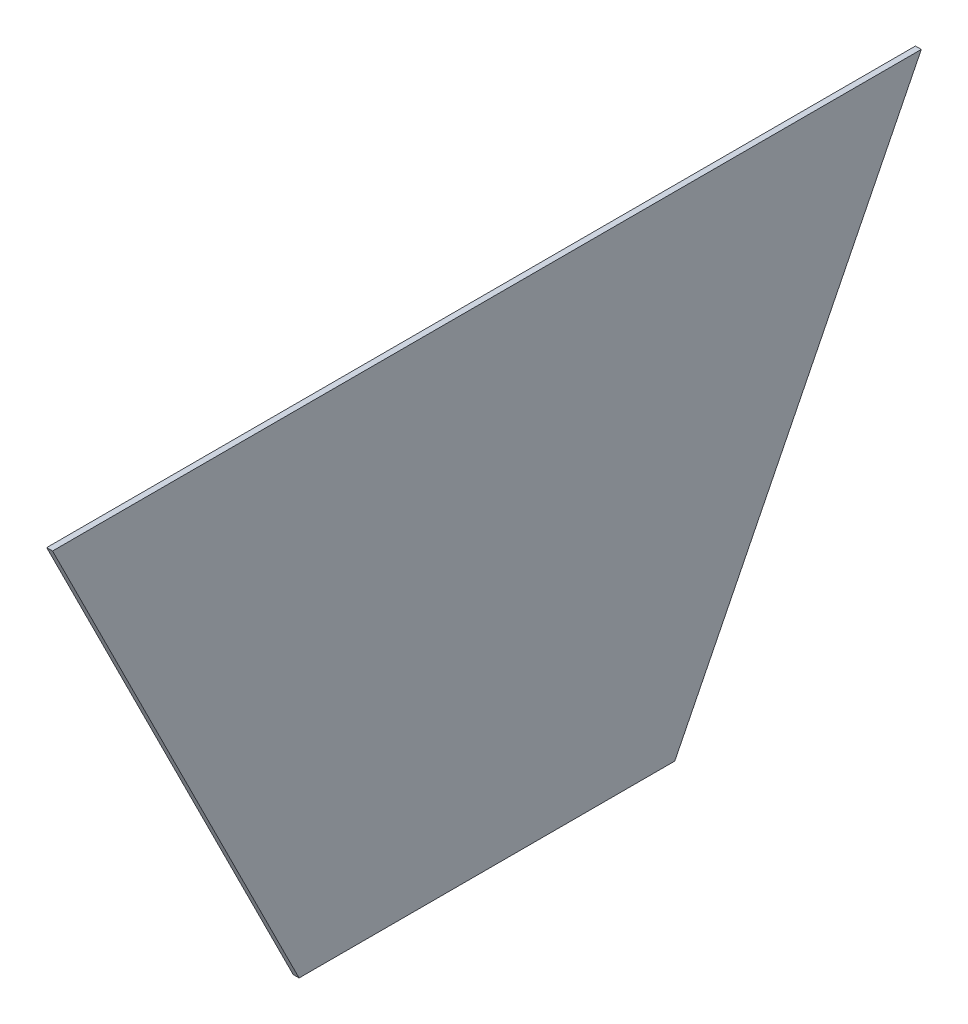
ISO-10303-21;
HEADER;
FILE_DESCRIPTION(('STEP AP214'),'2;1');
FILE_NAME('part.step','',(''),(''),'','','');
FILE_SCHEMA(('AUTOMOTIVE_DESIGN { 1 0 10303 214 1 1 1 1 }'));
ENDSEC;
DATA;
#1=APPLICATION_CONTEXT('core data for automotive mechanical design processes');
#2=APPLICATION_PROTOCOL_DEFINITION('international standard','automotive_design',2000,#1);
#3=PRODUCT_CONTEXT('',#1,'mechanical');
#4=PRODUCT('Part','Part','',(#3));
#5=PRODUCT_RELATED_PRODUCT_CATEGORY('part','',(#4));
#6=PRODUCT_DEFINITION_FORMATION('','',#4);
#7=PRODUCT_DEFINITION_CONTEXT('part definition',#1,'design');
#8=PRODUCT_DEFINITION('design','',#6,#7);
#9=PRODUCT_DEFINITION_SHAPE('','',#8);
#10=(LENGTH_UNIT() NAMED_UNIT(*) SI_UNIT(.MILLI.,.METRE.));
#11=(NAMED_UNIT(*) PLANE_ANGLE_UNIT() SI_UNIT($,.RADIAN.));
#12=(NAMED_UNIT(*) SI_UNIT($,.STERADIAN.) SOLID_ANGLE_UNIT());
#13=UNCERTAINTY_MEASURE_WITH_UNIT(LENGTH_MEASURE(1.E-05),#10,'distance_accuracy_value','');
#14=(GEOMETRIC_REPRESENTATION_CONTEXT(3) GLOBAL_UNCERTAINTY_ASSIGNED_CONTEXT((#13)) GLOBAL_UNIT_ASSIGNED_CONTEXT((#10,
#11,#12)) REPRESENTATION_CONTEXT('',''));
#15=CARTESIAN_POINT('',(0.,0.,0.));
#16=DIRECTION('',(0.,0.,1.));
#17=DIRECTION('',(1.,0.,0.));
#18=AXIS2_PLACEMENT_3D('',#15,#16,#17);
#19=CARTESIAN_POINT('',(3.175,0.,0.));
#20=DIRECTION('',(0.,1.,0.));
#21=DIRECTION('',(0.,0.,1.));
#22=AXIS2_PLACEMENT_3D('',#19,#20,#21);
#23=PLANE('',#22);
#24=DIRECTION('',(0.,0.,-1.));
#25=VECTOR('',#24,1.);
#26=CARTESIAN_POINT('',(0.,0.,0.));
#27=LINE('',#26,#25);
#28=CARTESIAN_POINT('',(0.,0.,101.6));
#29=VERTEX_POINT('',#28);
#30=CARTESIAN_POINT('',(0.,0.,-101.6));
#31=VERTEX_POINT('',#30);
#32=EDGE_CURVE('E72',#29,#31,#27,.T.);
#33=ORIENTED_EDGE('',*,*,#32,.T.);
#34=DIRECTION('',(-1.,0.,0.));
#35=VECTOR('',#34,1.);
#36=CARTESIAN_POINT('',(3.175,0.,-101.6));
#37=LINE('',#36,#35);
#38=CARTESIAN_POINT('',(3.175,0.,-101.6));
#39=VERTEX_POINT('',#38);
#40=EDGE_CURVE('E11',#39,#31,#37,.T.);
#41=ORIENTED_EDGE('',*,*,#40,.F.);
#42=DIRECTION('',(0.,0.,-1.));
#43=VECTOR('',#42,1.);
#44=CARTESIAN_POINT('',(3.175,0.,0.));
#45=LINE('',#44,#43);
#46=CARTESIAN_POINT('',(3.175,0.,101.6));
#47=VERTEX_POINT('',#46);
#48=EDGE_CURVE('E77',#47,#39,#45,.T.);
#49=ORIENTED_EDGE('',*,*,#48,.F.);
#50=DIRECTION('',(-1.,0.,0.));
#51=VECTOR('',#50,1.);
#52=CARTESIAN_POINT('',(3.175,0.,101.6));
#53=LINE('',#52,#51);
#54=EDGE_CURVE('E92',#47,#29,#53,.T.);
#55=ORIENTED_EDGE('',*,*,#54,.T.);
#56=EDGE_LOOP('',(#33,#41,#49,#55));
#57=FACE_BOUND('',#56,.T.);
#58=ADVANCED_FACE('F32',(#57),#23,.F.);
#59=CARTESIAN_POINT('',(3.175,0.,-101.6));
#60=DIRECTION('',(0.,0.447213595499958,0.894427190999916));
#61=DIRECTION('',(0.,-0.894427190999916,0.447213595499958));
#62=AXIS2_PLACEMENT_3D('',#59,#60,#61);
#63=PLANE('',#62);
#64=DIRECTION('',(0.,0.894427190999916,-0.447213595499958));
#65=VECTOR('',#64,1.);
#66=CARTESIAN_POINT('',(0.,0.,-101.6));
#67=LINE('',#66,#65);
#68=CARTESIAN_POINT('',(0.,266.7,-234.95));
#69=VERTEX_POINT('',#68);
#70=EDGE_CURVE('E88',#31,#69,#67,.T.);
#71=ORIENTED_EDGE('',*,*,#70,.T.);
#72=DIRECTION('',(-1.,0.,0.));
#73=VECTOR('',#72,1.);
#74=CARTESIAN_POINT('',(3.175,266.7,-234.95));
#75=LINE('',#74,#73);
#76=CARTESIAN_POINT('',(3.175,266.7,-234.95));
#77=VERTEX_POINT('',#76);
#78=EDGE_CURVE('E40',#77,#69,#75,.T.);
#79=ORIENTED_EDGE('',*,*,#78,.F.);
#80=DIRECTION('',(0.,0.894427190999916,-0.447213595499958));
#81=VECTOR('',#80,1.);
#82=CARTESIAN_POINT('',(3.175,0.,-101.6));
#83=LINE('',#82,#81);
#84=EDGE_CURVE('E80',#39,#77,#83,.T.);
#85=ORIENTED_EDGE('',*,*,#84,.F.);
#86=ORIENTED_EDGE('',*,*,#40,.T.);
#87=EDGE_LOOP('',(#71,#79,#85,#86));
#88=FACE_BOUND('',#87,.T.);
#89=ADVANCED_FACE('F87',(#88),#63,.F.);
#90=CARTESIAN_POINT('',(3.175,266.7,-234.95));
#91=DIRECTION('',(0.,-1.,0.));
#92=DIRECTION('',(0.,0.,-1.));
#93=AXIS2_PLACEMENT_3D('',#90,#91,#92);
#94=PLANE('',#93);
#95=DIRECTION('',(0.,0.,1.));
#96=VECTOR('',#95,1.);
#97=CARTESIAN_POINT('',(0.,266.7,-234.95));
#98=LINE('',#97,#96);
#99=CARTESIAN_POINT('',(0.,266.7,234.95));
#100=VERTEX_POINT('',#99);
#101=EDGE_CURVE('E65',#69,#100,#98,.T.);
#102=ORIENTED_EDGE('',*,*,#101,.T.);
#103=DIRECTION('',(-1.,0.,0.));
#104=VECTOR('',#103,1.);
#105=CARTESIAN_POINT('',(3.175,266.7,234.95));
#106=LINE('',#105,#104);
#107=CARTESIAN_POINT('',(3.175,266.7,234.95));
#108=VERTEX_POINT('',#107);
#109=EDGE_CURVE('E89',#108,#100,#106,.T.);
#110=ORIENTED_EDGE('',*,*,#109,.F.);
#111=DIRECTION('',(0.,0.,1.));
#112=VECTOR('',#111,1.);
#113=CARTESIAN_POINT('',(3.175,266.7,-234.95));
#114=LINE('',#113,#112);
#115=EDGE_CURVE('E84',#77,#108,#114,.T.);
#116=ORIENTED_EDGE('',*,*,#115,.F.);
#117=ORIENTED_EDGE('',*,*,#78,.T.);
#118=EDGE_LOOP('',(#102,#110,#116,#117));
#119=FACE_BOUND('',#118,.T.);
#120=ADVANCED_FACE('F90',(#119),#94,.F.);
#121=CARTESIAN_POINT('',(3.175,0.,101.6));
#122=DIRECTION('',(0.,0.447213595499958,-0.894427190999916));
#123=DIRECTION('',(0.,0.894427190999916,0.447213595499958));
#124=AXIS2_PLACEMENT_3D('',#121,#122,#123);
#125=PLANE('',#124);
#126=DIRECTION('',(0.,-0.894427190999916,-0.447213595499958));
#127=VECTOR('',#126,1.);
#128=CARTESIAN_POINT('',(0.,0.,101.6));
#129=LINE('',#128,#127);
#130=EDGE_CURVE('E99',#100,#29,#129,.T.);
#131=ORIENTED_EDGE('',*,*,#130,.T.);
#132=ORIENTED_EDGE('',*,*,#54,.F.);
#133=DIRECTION('',(0.,-0.894427190999916,-0.447213595499958));
#134=VECTOR('',#133,1.);
#135=CARTESIAN_POINT('',(3.175,0.,101.6));
#136=LINE('',#135,#134);
#137=EDGE_CURVE('E48',#108,#47,#136,.T.);
#138=ORIENTED_EDGE('',*,*,#137,.F.);
#139=ORIENTED_EDGE('',*,*,#109,.T.);
#140=EDGE_LOOP('',(#131,#132,#138,#139));
#141=FACE_BOUND('',#140,.T.);
#142=ADVANCED_FACE('F104',(#141),#125,.F.);
#143=CARTESIAN_POINT('',(3.175,0.,0.));
#144=DIRECTION('',(-1.,0.,0.));
#145=DIRECTION('',(0.,0.,1.));
#146=AXIS2_PLACEMENT_3D('',#143,#144,#145);
#147=PLANE('',#146);
#148=ORIENTED_EDGE('',*,*,#48,.T.);
#149=ORIENTED_EDGE('',*,*,#84,.T.);
#150=ORIENTED_EDGE('',*,*,#115,.T.);
#151=ORIENTED_EDGE('',*,*,#137,.T.);
#152=EDGE_LOOP('',(#148,#149,#150,#151));
#153=FACE_BOUND('',#152,.T.);
#154=ADVANCED_FACE('F82',(#153),#147,.F.);
#155=CARTESIAN_POINT('',(0.,0.,0.));
#156=DIRECTION('',(-1.,0.,0.));
#157=DIRECTION('',(0.,0.,1.));
#158=AXIS2_PLACEMENT_3D('',#155,#156,#157);
#159=PLANE('',#158);
#160=ORIENTED_EDGE('',*,*,#32,.F.);
#161=ORIENTED_EDGE('',*,*,#130,.F.);
#162=ORIENTED_EDGE('',*,*,#101,.F.);
#163=ORIENTED_EDGE('',*,*,#70,.F.);
#164=EDGE_LOOP('',(#160,#161,#162,#163));
#165=FACE_BOUND('',#164,.T.);
#166=ADVANCED_FACE('F105',(#165),#159,.T.);
#167=CLOSED_SHELL('',(#58,#89,#120,#142,#154,#166));
#168=MANIFOLD_SOLID_BREP('B2',#167);
#169=ADVANCED_BREP_SHAPE_REPRESENTATION('',(#18,#168),#14);
#170=SHAPE_DEFINITION_REPRESENTATION(#9,#169);
ENDSEC;
END-ISO-10303-21;
